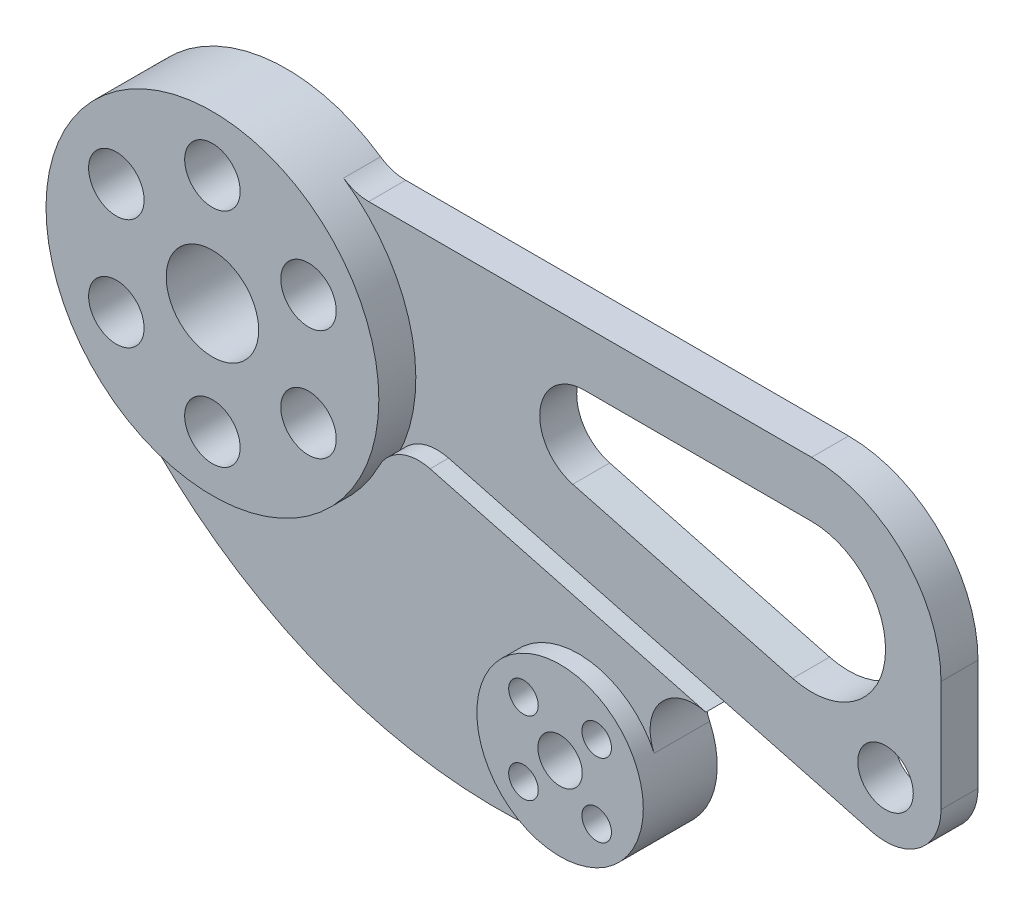
ISO-10303-21;
HEADER;
FILE_DESCRIPTION(('STEP AP214'),'2;1');
FILE_NAME('part.step','',(''),(''),'','','');
FILE_SCHEMA(('AUTOMOTIVE_DESIGN { 1 0 10303 214 1 1 1 1 }'));
ENDSEC;
DATA;
#1=APPLICATION_CONTEXT('core data for automotive mechanical design processes');
#2=APPLICATION_PROTOCOL_DEFINITION('international standard','automotive_design',2000,#1);
#3=PRODUCT_CONTEXT('',#1,'mechanical');
#4=PRODUCT('Part','Part','',(#3));
#5=PRODUCT_RELATED_PRODUCT_CATEGORY('part','',(#4));
#6=PRODUCT_DEFINITION_FORMATION('','',#4);
#7=PRODUCT_DEFINITION_CONTEXT('part definition',#1,'design');
#8=PRODUCT_DEFINITION('design','',#6,#7);
#9=PRODUCT_DEFINITION_SHAPE('','',#8);
#10=(LENGTH_UNIT() NAMED_UNIT(*) SI_UNIT(.MILLI.,.METRE.));
#11=(NAMED_UNIT(*) PLANE_ANGLE_UNIT() SI_UNIT($,.RADIAN.));
#12=(NAMED_UNIT(*) SI_UNIT($,.STERADIAN.) SOLID_ANGLE_UNIT());
#13=UNCERTAINTY_MEASURE_WITH_UNIT(LENGTH_MEASURE(1.E-05),#10,'distance_accuracy_value','');
#14=(GEOMETRIC_REPRESENTATION_CONTEXT(3) GLOBAL_UNCERTAINTY_ASSIGNED_CONTEXT((#13)) GLOBAL_UNIT_ASSIGNED_CONTEXT((#10,
#11,#12)) REPRESENTATION_CONTEXT('',''));
#15=CARTESIAN_POINT('',(0.,0.,0.));
#16=DIRECTION('',(0.,0.,1.));
#17=DIRECTION('',(1.,0.,0.));
#18=AXIS2_PLACEMENT_3D('',#15,#16,#17);
#19=CARTESIAN_POINT('',(0.,0.,20.));
#20=DIRECTION('',(0.,0.,-1.));
#21=DIRECTION('',(-1.,0.,0.));
#22=AXIS2_PLACEMENT_3D('',#19,#20,#21);
#23=CYLINDRICAL_SURFACE('',#22,45.);
#24=CARTESIAN_POINT('',(0.,0.,20.));
#25=DIRECTION('',(0.,0.,1.));
#26=DIRECTION('',(1.,0.,0.));
#27=AXIS2_PLACEMENT_3D('',#24,#25,#26);
#28=CIRCLE('',#27,45.);
#29=CARTESIAN_POINT('',(45.,0.,20.));
#30=VERTEX_POINT('',#29);
#31=EDGE_CURVE('E228',#30,#30,#28,.T.);
#32=ORIENTED_EDGE('',*,*,#31,.F.);
#33=EDGE_LOOP('',(#32));
#34=FACE_BOUND('',#33,.T.);
#35=DIRECTION('',(0.,0.,-1.));
#36=VECTOR('',#35,1.);
#37=CARTESIAN_POINT('',(-38.103740681001,-23.9396104002348,15.));
#38=LINE('',#37,#36);
#39=CARTESIAN_POINT('',(-38.103740681001,-23.9396104002348,15.));
#40=VERTEX_POINT('',#39);
#41=CARTESIAN_POINT('',(-38.103740681001,-23.9396104002348,0.));
#42=VERTEX_POINT('',#41);
#43=EDGE_CURVE('E167',#40,#42,#38,.T.);
#44=ORIENTED_EDGE('',*,*,#43,.F.);
#45=CARTESIAN_POINT('',(0.,0.,15.));
#46=DIRECTION('',(0.,0.,1.));
#47=DIRECTION('',(1.,0.,0.));
#48=AXIS2_PLACEMENT_3D('',#45,#46,#47);
#49=CIRCLE('',#48,45.);
#50=CARTESIAN_POINT('',(40.1039882650915,-20.4124992402549,15.));
#51=VERTEX_POINT('',#50);
#52=EDGE_CURVE('E176',#40,#51,#49,.T.);
#53=ORIENTED_EDGE('',*,*,#52,.T.);
#54=DIRECTION('',(0.,0.,-1.));
#55=VECTOR('',#54,1.);
#56=CARTESIAN_POINT('',(40.1039882650915,-20.4124992402549,15.));
#57=LINE('',#56,#55);
#58=CARTESIAN_POINT('',(40.1039882650915,-20.4124992402549,10.));
#59=VERTEX_POINT('',#58);
#60=EDGE_CURVE('E189',#51,#59,#57,.T.);
#61=ORIENTED_EDGE('',*,*,#60,.T.);
#62=CARTESIAN_POINT('',(0.,0.,10.));
#63=DIRECTION('',(0.,0.,1.));
#64=DIRECTION('',(1.,0.,0.));
#65=AXIS2_PLACEMENT_3D('',#62,#63,#64);
#66=CIRCLE('',#65,45.);
#67=CARTESIAN_POINT('',(25.4597613104165,37.1052631578947,10.));
#68=VERTEX_POINT('',#67);
#69=EDGE_CURVE('E271',#59,#68,#66,.T.);
#70=ORIENTED_EDGE('',*,*,#69,.T.);
#71=DIRECTION('',(0.,0.,-1.));
#72=VECTOR('',#71,1.);
#73=CARTESIAN_POINT('',(25.4597613104165,37.1052631578947,10.));
#74=LINE('',#73,#72);
#75=CARTESIAN_POINT('',(25.4597613104165,37.1052631578947,0.));
#76=VERTEX_POINT('',#75);
#77=EDGE_CURVE('E287',#68,#76,#74,.T.);
#78=ORIENTED_EDGE('',*,*,#77,.T.);
#79=CARTESIAN_POINT('',(0.,0.,0.));
#80=DIRECTION('',(0.,0.,1.));
#81=DIRECTION('',(1.,0.,0.));
#82=AXIS2_PLACEMENT_3D('',#79,#80,#81);
#83=CIRCLE('',#82,45.);
#84=EDGE_CURVE('E210',#76,#42,#83,.T.);
#85=ORIENTED_EDGE('',*,*,#84,.T.);
#86=EDGE_LOOP('',(#44,#53,#61,#70,#78,#85));
#87=FACE_BOUND('',#86,.T.);
#88=ADVANCED_FACE('F36',(#34,#87),#23,.T.);
#89=CARTESIAN_POINT('',(90.4975746549419,7.99999999999999,10.));
#90=DIRECTION('',(0.,0.,-1.));
#91=DIRECTION('',(-1.,0.,0.));
#92=AXIS2_PLACEMENT_3D('',#89,#90,#91);
#93=CYLINDRICAL_SURFACE('',#92,12.);
#94=CARTESIAN_POINT('',(90.4975746549419,7.99999999999999,0.));
#95=DIRECTION('',(0.,0.,1.));
#96=DIRECTION('',(1.,0.,0.));
#97=AXIS2_PLACEMENT_3D('',#94,#95,#96);
#98=CIRCLE('',#97,12.);
#99=CARTESIAN_POINT('',(90.4975746549419,20.,0.));
#100=VERTEX_POINT('',#99);
#101=CARTESIAN_POINT('',(87.4276884417238,-3.60068095578415,0.));
#102=VERTEX_POINT('',#101);
#103=EDGE_CURVE('E306',#100,#102,#98,.T.);
#104=ORIENTED_EDGE('',*,*,#103,.F.);
#105=DIRECTION('',(0.,0.,-1.));
#106=VECTOR('',#105,1.);
#107=CARTESIAN_POINT('',(90.4975746549419,20.,10.));
#108=LINE('',#107,#106);
#109=CARTESIAN_POINT('',(90.4975746549419,20.,10.));
#110=VERTEX_POINT('',#109);
#111=EDGE_CURVE('E11',#110,#100,#108,.T.);
#112=ORIENTED_EDGE('',*,*,#111,.F.);
#113=CARTESIAN_POINT('',(90.4975746549419,7.99999999999999,10.));
#114=DIRECTION('',(0.,0.,1.));
#115=DIRECTION('',(1.,0.,0.));
#116=AXIS2_PLACEMENT_3D('',#113,#114,#115);
#117=CIRCLE('',#116,12.);
#118=CARTESIAN_POINT('',(87.4276884417238,-3.60068095578415,10.));
#119=VERTEX_POINT('',#118);
#120=EDGE_CURVE('E276',#110,#119,#117,.T.);
#121=ORIENTED_EDGE('',*,*,#120,.T.);
#122=DIRECTION('',(0.,0.,-1.));
#123=VECTOR('',#122,1.);
#124=CARTESIAN_POINT('',(87.4276884417238,-3.60068095578415,10.));
#125=LINE('',#124,#123);
#126=EDGE_CURVE('E317',#119,#102,#125,.T.);
#127=ORIENTED_EDGE('',*,*,#126,.T.);
#128=EDGE_LOOP('',(#104,#112,#121,#127));
#129=FACE_BOUND('',#128,.T.);
#130=ADVANCED_FACE('F354',(#129),#93,.F.);
#131=CARTESIAN_POINT('',(0.,20.,10.));
#132=DIRECTION('',(0.,-1.,0.));
#133=DIRECTION('',(1.,0.,0.));
#134=AXIS2_PLACEMENT_3D('',#131,#132,#133);
#135=PLANE('',#134);
#136=DIRECTION('',(-1.,0.,0.));
#137=VECTOR('',#136,1.);
#138=CARTESIAN_POINT('',(0.,20.,0.));
#139=LINE('',#138,#137);
#140=CARTESIAN_POINT('',(152.,20.,0.));
#141=VERTEX_POINT('',#140);
#142=EDGE_CURVE('E309',#141,#100,#139,.T.);
#143=ORIENTED_EDGE('',*,*,#142,.F.);
#144=DIRECTION('',(0.,0.,-1.));
#145=VECTOR('',#144,1.);
#146=CARTESIAN_POINT('',(152.,20.,10.));
#147=LINE('',#146,#145);
#148=CARTESIAN_POINT('',(152.,20.,10.));
#149=VERTEX_POINT('',#148);
#150=EDGE_CURVE('E45',#149,#141,#147,.T.);
#151=ORIENTED_EDGE('',*,*,#150,.F.);
#152=DIRECTION('',(-1.,0.,0.));
#153=VECTOR('',#152,1.);
#154=CARTESIAN_POINT('',(0.,20.,10.));
#155=LINE('',#154,#153);
#156=EDGE_CURVE('E279',#149,#110,#155,.T.);
#157=ORIENTED_EDGE('',*,*,#156,.T.);
#158=ORIENTED_EDGE('',*,*,#111,.T.);
#159=EDGE_LOOP('',(#143,#151,#157,#158));
#160=FACE_BOUND('',#159,.T.);
#161=ADVANCED_FACE('F350',(#160),#135,.T.);
#162=CARTESIAN_POINT('',(152.,0.,10.));
#163=DIRECTION('',(0.,0.,-1.));
#164=DIRECTION('',(-1.,0.,0.));
#165=AXIS2_PLACEMENT_3D('',#162,#163,#164);
#166=CYLINDRICAL_SURFACE('',#165,20.);
#167=CARTESIAN_POINT('',(152.,0.,0.));
#168=DIRECTION('',(0.,0.,1.));
#169=DIRECTION('',(1.,0.,0.));
#170=AXIS2_PLACEMENT_3D('',#167,#168,#169);
#171=CIRCLE('',#170,20.);
#172=CARTESIAN_POINT('',(146.88352297797,-19.3344682596403,0.));
#173=VERTEX_POINT('',#172);
#174=EDGE_CURVE('E312',#173,#141,#171,.T.);
#175=ORIENTED_EDGE('',*,*,#174,.F.);
#176=DIRECTION('',(0.,0.,-1.));
#177=VECTOR('',#176,1.);
#178=CARTESIAN_POINT('',(146.88352297797,-19.3344682596403,10.));
#179=LINE('',#178,#177);
#180=CARTESIAN_POINT('',(146.88352297797,-19.3344682596403,10.));
#181=VERTEX_POINT('',#180);
#182=EDGE_CURVE('E319',#181,#173,#179,.T.);
#183=ORIENTED_EDGE('',*,*,#182,.F.);
#184=CARTESIAN_POINT('',(152.,0.,10.));
#185=DIRECTION('',(0.,0.,1.));
#186=DIRECTION('',(1.,0.,0.));
#187=AXIS2_PLACEMENT_3D('',#184,#185,#186);
#188=CIRCLE('',#187,20.);
#189=EDGE_CURVE('E282',#181,#149,#188,.T.);
#190=ORIENTED_EDGE('',*,*,#189,.T.);
#191=ORIENTED_EDGE('',*,*,#150,.T.);
#192=EDGE_LOOP('',(#175,#183,#190,#191));
#193=FACE_BOUND('',#192,.T.);
#194=ADVANCED_FACE('F344',(#193),#166,.F.);
#195=CARTESIAN_POINT('',(0.,0.,10.));
#196=DIRECTION('',(-0.255823851101514,-0.966723412982012,0.));
#197=DIRECTION('',(0.966723412982013,-0.255823851101514,0.));
#198=AXIS2_PLACEMENT_3D('',#195,#196,#197);
#199=PLANE('',#198);
#200=DIRECTION('',(0.,0.,-1.));
#201=VECTOR('',#200,1.);
#202=CARTESIAN_POINT('',(128.412955315551,-33.9818983578937,15.));
#203=LINE('',#202,#201);
#204=CARTESIAN_POINT('',(128.412955315551,-33.9818983578937,10.));
#205=VERTEX_POINT('',#204);
#206=CARTESIAN_POINT('',(128.412955315551,-33.9818983578937,0.));
#207=VERTEX_POINT('',#206);
#208=EDGE_CURVE('E60',#205,#207,#203,.T.);
#209=ORIENTED_EDGE('',*,*,#208,.T.);
#210=DIRECTION('',(-0.966723412982013,0.255823851101514,0.));
#211=VECTOR('',#210,1.);
#212=CARTESIAN_POINT('',(0.,0.,0.));
#213=LINE('',#212,#211);
#214=CARTESIAN_POINT('',(168.162642233477,-44.5008511947302,0.));
#215=VERTEX_POINT('',#214);
#216=EDGE_CURVE('E231',#215,#207,#213,.T.);
#217=ORIENTED_EDGE('',*,*,#216,.F.);
#218=DIRECTION('',(0.,0.,-1.));
#219=VECTOR('',#218,1.);
#220=CARTESIAN_POINT('',(168.162642233477,-44.5008511947302,10.));
#221=LINE('',#220,#219);
#222=CARTESIAN_POINT('',(168.162642233477,-44.5008511947302,10.));
#223=VERTEX_POINT('',#222);
#224=EDGE_CURVE('E40',#223,#215,#221,.T.);
#225=ORIENTED_EDGE('',*,*,#224,.F.);
#226=DIRECTION('',(-0.966723412982013,0.255823851101514,0.));
#227=VECTOR('',#226,1.);
#228=CARTESIAN_POINT('',(0.,0.,10.));
#229=LINE('',#228,#227);
#230=EDGE_CURVE('E256',#223,#205,#229,.T.);
#231=ORIENTED_EDGE('',*,*,#230,.T.);
#232=EDGE_LOOP('',(#209,#217,#225,#231));
#233=FACE_BOUND('',#232,.T.);
#234=ADVANCED_FACE('F38',(#233),#199,.T.);
#235=CARTESIAN_POINT('',(172.,-30.,10.));
#236=DIRECTION('',(0.,0.,-1.));
#237=DIRECTION('',(-1.,0.,0.));
#238=AXIS2_PLACEMENT_3D('',#235,#236,#237);
#239=CYLINDRICAL_SURFACE('',#238,15.);
#240=CARTESIAN_POINT('',(172.,-30.,0.));
#241=DIRECTION('',(0.,0.,1.));
#242=DIRECTION('',(1.,0.,0.));
#243=AXIS2_PLACEMENT_3D('',#240,#241,#242);
#244=CIRCLE('',#243,15.);
#245=CARTESIAN_POINT('',(187.,-30.,0.));
#246=VERTEX_POINT('',#245);
#247=EDGE_CURVE('E289',#215,#246,#244,.T.);
#248=ORIENTED_EDGE('',*,*,#247,.T.);
#249=DIRECTION('',(0.,0.,-1.));
#250=VECTOR('',#249,1.);
#251=CARTESIAN_POINT('',(187.,-30.,10.));
#252=LINE('',#251,#250);
#253=CARTESIAN_POINT('',(187.,-30.,10.));
#254=VERTEX_POINT('',#253);
#255=EDGE_CURVE('E330',#254,#246,#252,.T.);
#256=ORIENTED_EDGE('',*,*,#255,.F.);
#257=CARTESIAN_POINT('',(172.,-30.,10.));
#258=DIRECTION('',(0.,0.,1.));
#259=DIRECTION('',(1.,0.,0.));
#260=AXIS2_PLACEMENT_3D('',#257,#258,#259);
#261=CIRCLE('',#260,15.);
#262=EDGE_CURVE('E259',#223,#254,#261,.T.);
#263=ORIENTED_EDGE('',*,*,#262,.F.);
#264=ORIENTED_EDGE('',*,*,#224,.T.);
#265=EDGE_LOOP('',(#248,#256,#263,#264));
#266=FACE_BOUND('',#265,.T.);
#267=ADVANCED_FACE('F337',(#266),#239,.T.);
#268=CARTESIAN_POINT('',(187.,0.,10.));
#269=DIRECTION('',(1.,0.,0.));
#270=DIRECTION('',(0.,0.,-1.));
#271=AXIS2_PLACEMENT_3D('',#268,#269,#270);
#272=PLANE('',#271);
#273=DIRECTION('',(0.,-1.,0.));
#274=VECTOR('',#273,1.);
#275=CARTESIAN_POINT('',(187.,0.,0.));
#276=LINE('',#275,#274);
#277=CARTESIAN_POINT('',(187.,0.,0.));
#278=VERTEX_POINT('',#277);
#279=EDGE_CURVE('E292',#278,#246,#276,.T.);
#280=ORIENTED_EDGE('',*,*,#279,.F.);
#281=DIRECTION('',(0.,0.,-1.));
#282=VECTOR('',#281,1.);
#283=CARTESIAN_POINT('',(187.,0.,10.));
#284=LINE('',#283,#282);
#285=CARTESIAN_POINT('',(187.,0.,10.));
#286=VERTEX_POINT('',#285);
#287=EDGE_CURVE('E329',#286,#278,#284,.T.);
#288=ORIENTED_EDGE('',*,*,#287,.F.);
#289=DIRECTION('',(0.,-1.,0.));
#290=VECTOR('',#289,1.);
#291=CARTESIAN_POINT('',(187.,0.,10.));
#292=LINE('',#291,#290);
#293=EDGE_CURVE('E261',#286,#254,#292,.T.);
#294=ORIENTED_EDGE('',*,*,#293,.T.);
#295=ORIENTED_EDGE('',*,*,#255,.T.);
#296=EDGE_LOOP('',(#280,#288,#294,#295));
#297=FACE_BOUND('',#296,.T.);
#298=ADVANCED_FACE('F349',(#297),#272,.T.);
#299=CARTESIAN_POINT('',(152.,0.,10.));
#300=DIRECTION('',(0.,0.,-1.));
#301=DIRECTION('',(-1.,0.,0.));
#302=AXIS2_PLACEMENT_3D('',#299,#300,#301);
#303=CYLINDRICAL_SURFACE('',#302,35.);
#304=CARTESIAN_POINT('',(152.,0.,0.));
#305=DIRECTION('',(0.,0.,1.));
#306=DIRECTION('',(1.,0.,0.));
#307=AXIS2_PLACEMENT_3D('',#304,#305,#306);
#308=CIRCLE('',#307,35.);
#309=CARTESIAN_POINT('',(152.,35.,0.));
#310=VERTEX_POINT('',#309);
#311=EDGE_CURVE('E295',#278,#310,#308,.T.);
#312=ORIENTED_EDGE('',*,*,#311,.T.);
#313=DIRECTION('',(0.,0.,-1.));
#314=VECTOR('',#313,1.);
#315=CARTESIAN_POINT('',(152.,35.,10.));
#316=LINE('',#315,#314);
#317=CARTESIAN_POINT('',(152.,35.,10.));
#318=VERTEX_POINT('',#317);
#319=EDGE_CURVE('E326',#318,#310,#316,.T.);
#320=ORIENTED_EDGE('',*,*,#319,.F.);
#321=CARTESIAN_POINT('',(152.,0.,10.));
#322=DIRECTION('',(0.,0.,1.));
#323=DIRECTION('',(1.,0.,0.));
#324=AXIS2_PLACEMENT_3D('',#321,#322,#323);
#325=CIRCLE('',#324,35.);
#326=EDGE_CURVE('E264',#286,#318,#325,.T.);
#327=ORIENTED_EDGE('',*,*,#326,.F.);
#328=ORIENTED_EDGE('',*,*,#287,.T.);
#329=EDGE_LOOP('',(#312,#320,#327,#328));
#330=FACE_BOUND('',#329,.T.);
#331=ADVANCED_FACE('F419',(#330),#303,.T.);
#332=CARTESIAN_POINT('',(0.,35.,10.));
#333=DIRECTION('',(0.,-1.,0.));
#334=DIRECTION('',(1.,0.,0.));
#335=AXIS2_PLACEMENT_3D('',#332,#333,#334);
#336=PLANE('',#335);
#337=DIRECTION('',(-1.,0.,0.));
#338=VECTOR('',#337,1.);
#339=CARTESIAN_POINT('',(0.,35.,0.));
#340=LINE('',#339,#338);
#341=CARTESIAN_POINT('',(32.2490309931942,35.,0.));
#342=VERTEX_POINT('',#341);
#343=EDGE_CURVE('E297',#310,#342,#340,.T.);
#344=ORIENTED_EDGE('',*,*,#343,.T.);
#345=DIRECTION('',(0.,0.,-1.));
#346=VECTOR('',#345,1.);
#347=CARTESIAN_POINT('',(32.2490309931942,35.,10.));
#348=LINE('',#347,#346);
#349=CARTESIAN_POINT('',(32.2490309931942,35.,10.));
#350=VERTEX_POINT('',#349);
#351=EDGE_CURVE('E324',#350,#342,#348,.T.);
#352=ORIENTED_EDGE('',*,*,#351,.F.);
#353=DIRECTION('',(-1.,0.,0.));
#354=VECTOR('',#353,1.);
#355=CARTESIAN_POINT('',(0.,35.,10.));
#356=LINE('',#355,#354);
#357=EDGE_CURVE('E266',#318,#350,#356,.T.);
#358=ORIENTED_EDGE('',*,*,#357,.F.);
#359=ORIENTED_EDGE('',*,*,#319,.T.);
#360=EDGE_LOOP('',(#344,#352,#358,#359));
#361=FACE_BOUND('',#360,.T.);
#362=ADVANCED_FACE('F415',(#361),#336,.F.);
#363=CARTESIAN_POINT('',(32.2490309931942,47.,10.));
#364=DIRECTION('',(0.,0.,-1.));
#365=DIRECTION('',(-1.,0.,0.));
#366=AXIS2_PLACEMENT_3D('',#363,#364,#365);
#367=CYLINDRICAL_SURFACE('',#366,12.);
#368=CARTESIAN_POINT('',(32.2490309931942,47.,0.));
#369=DIRECTION('',(0.,0.,1.));
#370=DIRECTION('',(1.,0.,0.));
#371=AXIS2_PLACEMENT_3D('',#368,#369,#370);
#372=CIRCLE('',#371,12.);
#373=EDGE_CURVE('E300',#76,#342,#372,.T.);
#374=ORIENTED_EDGE('',*,*,#373,.F.);
#375=ORIENTED_EDGE('',*,*,#77,.F.);
#376=CARTESIAN_POINT('',(32.2490309931942,47.,10.));
#377=DIRECTION('',(0.,0.,1.));
#378=DIRECTION('',(1.,0.,0.));
#379=AXIS2_PLACEMENT_3D('',#376,#377,#378);
#380=CIRCLE('',#379,12.);
#381=EDGE_CURVE('E268',#68,#350,#380,.T.);
#382=ORIENTED_EDGE('',*,*,#381,.T.);
#383=ORIENTED_EDGE('',*,*,#351,.T.);
#384=EDGE_LOOP('',(#374,#375,#382,#383));
#385=FACE_BOUND('',#384,.T.);
#386=ADVANCED_FACE('F411',(#385),#367,.F.);
#387=CARTESIAN_POINT('',(172.,-30.,10.));
#388=DIRECTION('',(0.,0.,-1.));
#389=DIRECTION('',(-1.,0.,0.));
#390=AXIS2_PLACEMENT_3D('',#387,#388,#389);
#391=CYLINDRICAL_SURFACE('',#390,7.50000000000001);
#392=CARTESIAN_POINT('',(172.,-30.,10.));
#393=DIRECTION('',(0.,0.,1.));
#394=DIRECTION('',(1.,0.,0.));
#395=AXIS2_PLACEMENT_3D('',#392,#393,#394);
#396=CIRCLE('',#395,7.50000000000001);
#397=CARTESIAN_POINT('',(179.5,-30.,10.));
#398=VERTEX_POINT('',#397);
#399=EDGE_CURVE('E273',#398,#398,#396,.T.);
#400=ORIENTED_EDGE('',*,*,#399,.T.);
#401=EDGE_LOOP('',(#400));
#402=FACE_BOUND('',#401,.T.);
#403=CARTESIAN_POINT('',(172.,-30.,0.));
#404=DIRECTION('',(0.,0.,1.));
#405=DIRECTION('',(1.,0.,0.));
#406=AXIS2_PLACEMENT_3D('',#403,#404,#405);
#407=CIRCLE('',#406,7.50000000000001);
#408=CARTESIAN_POINT('',(179.5,-30.,0.));
#409=VERTEX_POINT('',#408);
#410=EDGE_CURVE('E303',#409,#409,#407,.T.);
#411=ORIENTED_EDGE('',*,*,#410,.F.);
#412=EDGE_LOOP('',(#411));
#413=FACE_BOUND('',#412,.T.);
#414=ADVANCED_FACE('F403',(#402,#413),#391,.F.);
#415=CARTESIAN_POINT('',(4.83129108241596,18.2567895221365,10.));
#416=DIRECTION('',(-0.255823851101514,-0.966723412982012,0.));
#417=DIRECTION('',(0.966723412982013,-0.255823851101514,0.));
#418=AXIS2_PLACEMENT_3D('',#415,#416,#417);
#419=PLANE('',#418);
#420=DIRECTION('',(-0.966723412982013,0.255823851101514,0.));
#421=VECTOR('',#420,1.);
#422=CARTESIAN_POINT('',(4.83129108241596,18.2567895221365,0.));
#423=LINE('',#422,#421);
#424=EDGE_CURVE('E257',#173,#102,#423,.T.);
#425=ORIENTED_EDGE('',*,*,#424,.T.);
#426=ORIENTED_EDGE('',*,*,#126,.F.);
#427=DIRECTION('',(-0.966723412982013,0.255823851101514,0.));
#428=VECTOR('',#427,1.);
#429=CARTESIAN_POINT('',(4.83129108241596,18.2567895221365,10.));
#430=LINE('',#429,#428);
#431=EDGE_CURVE('E285',#181,#119,#430,.T.);
#432=ORIENTED_EDGE('',*,*,#431,.F.);
#433=ORIENTED_EDGE('',*,*,#182,.T.);
#434=EDGE_LOOP('',(#425,#426,#432,#433));
#435=FACE_BOUND('',#434,.T.);
#436=ADVANCED_FACE('F399',(#435),#419,.F.);
#437=CARTESIAN_POINT('',(0.,0.,10.));
#438=DIRECTION('',(0.,0.,1.));
#439=DIRECTION('',(1.,0.,0.));
#440=AXIS2_PLACEMENT_3D('',#437,#438,#439);
#441=PLANE('',#440);
#442=CARTESIAN_POINT('',(50.7983851357825,-25.8558323709895,10.));
#443=DIRECTION('',(0.,0.,1.));
#444=DIRECTION('',(1.,0.,0.));
#445=AXIS2_PLACEMENT_3D('',#442,#443,#444);
#446=CIRCLE('',#445,12.);
#447=CARTESIAN_POINT('',(53.8682713490007,-14.2551514152054,10.));
#448=VERTEX_POINT('',#447);
#449=EDGE_CURVE('E253',#448,#59,#446,.T.);
#450=ORIENTED_EDGE('',*,*,#449,.F.);
#451=DIRECTION('',(0.966723412982012,-0.255823851101514,0.));
#452=VECTOR('',#451,1.);
#453=CARTESIAN_POINT('',(0.,0.,10.));
#454=LINE('',#453,#452);
#455=EDGE_CURVE('E53',#448,#205,#454,.T.);
#456=ORIENTED_EDGE('',*,*,#455,.T.);
#457=ORIENTED_EDGE('',*,*,#230,.F.);
#458=ORIENTED_EDGE('',*,*,#262,.T.);
#459=ORIENTED_EDGE('',*,*,#293,.F.);
#460=ORIENTED_EDGE('',*,*,#326,.T.);
#461=ORIENTED_EDGE('',*,*,#357,.T.);
#462=ORIENTED_EDGE('',*,*,#381,.F.);
#463=ORIENTED_EDGE('',*,*,#69,.F.);
#464=EDGE_LOOP('',(#450,#456,#457,#458,#459,#460,#461,#462,#463));
#465=FACE_BOUND('',#464,.T.);
#466=ORIENTED_EDGE('',*,*,#399,.F.);
#467=EDGE_LOOP('',(#466));
#468=FACE_BOUND('',#467,.T.);
#469=ORIENTED_EDGE('',*,*,#120,.F.);
#470=ORIENTED_EDGE('',*,*,#156,.F.);
#471=ORIENTED_EDGE('',*,*,#189,.F.);
#472=ORIENTED_EDGE('',*,*,#431,.T.);
#473=EDGE_LOOP('',(#469,#470,#471,#472));
#474=FACE_BOUND('',#473,.T.);
#475=ADVANCED_FACE('F396',(#465,#468,#474),#441,.T.);
#476=CARTESIAN_POINT('',(0.,0.,0.));
#477=DIRECTION('',(0.,0.,1.));
#478=DIRECTION('',(1.,0.,0.));
#479=AXIS2_PLACEMENT_3D('',#476,#477,#478);
#480=PLANE('',#479);
#481=ORIENTED_EDGE('',*,*,#216,.T.);
#482=CARTESIAN_POINT('',(125.343069102333,-45.5825793136779,0.));
#483=DIRECTION('',(0.,0.,1.));
#484=DIRECTION('',(1.,0.,0.));
#485=AXIS2_PLACEMENT_3D('',#482,#483,#484);
#486=CIRCLE('',#485,12.);
#487=CARTESIAN_POINT('',(114.441132023261,-50.5973343350073,0.));
#488=VERTEX_POINT('',#487);
#489=EDGE_CURVE('E191',#207,#488,#486,.T.);
#490=ORIENTED_EDGE('',*,*,#489,.T.);
#491=CARTESIAN_POINT('',(94.,-60.,0.));
#492=DIRECTION('',(0.,0.,1.));
#493=DIRECTION('',(1.,0.,0.));
#494=AXIS2_PLACEMENT_3D('',#491,#492,#493);
#495=CIRCLE('',#494,22.5);
#496=CARTESIAN_POINT('',(98.6101490330927,-82.0226366698603,0.));
#497=VERTEX_POINT('',#496);
#498=EDGE_CURVE('E439',#497,#488,#495,.T.);
#499=ORIENTED_EDGE('',*,*,#498,.F.);
#500=CARTESIAN_POINT('',(71.9737323974463,45.2192640893325,0.));
#501=DIRECTION('',(0.,0.,1.));
#502=DIRECTION('',(1.,0.,0.));
#503=AXIS2_PLACEMENT_3D('',#500,#501,#502);
#504=CIRCLE('',#503,130.);
#505=EDGE_CURVE('E162',#42,#497,#504,.T.);
#506=ORIENTED_EDGE('',*,*,#505,.F.);
#507=ORIENTED_EDGE('',*,*,#84,.F.);
#508=ORIENTED_EDGE('',*,*,#373,.T.);
#509=ORIENTED_EDGE('',*,*,#343,.F.);
#510=ORIENTED_EDGE('',*,*,#311,.F.);
#511=ORIENTED_EDGE('',*,*,#279,.T.);
#512=ORIENTED_EDGE('',*,*,#247,.F.);
#513=EDGE_LOOP('',(#481,#490,#499,#506,#507,#508,#509,#510,#511,#512));
#514=FACE_BOUND('',#513,.T.);
#515=ORIENTED_EDGE('',*,*,#410,.T.);
#516=EDGE_LOOP('',(#515));
#517=FACE_BOUND('',#516,.T.);
#518=ORIENTED_EDGE('',*,*,#103,.T.);
#519=ORIENTED_EDGE('',*,*,#424,.F.);
#520=ORIENTED_EDGE('',*,*,#174,.T.);
#521=ORIENTED_EDGE('',*,*,#142,.T.);
#522=EDGE_LOOP('',(#518,#519,#520,#521));
#523=FACE_BOUND('',#522,.T.);
#524=CARTESIAN_POINT('',(0.,0.,0.));
#525=DIRECTION('',(0.,0.,1.));
#526=DIRECTION('',(1.,0.,0.));
#527=AXIS2_PLACEMENT_3D('',#524,#525,#526);
#528=CIRCLE('',#527,12.5);
#529=CARTESIAN_POINT('',(12.5,0.,0.));
#530=VERTEX_POINT('',#529);
#531=EDGE_CURVE('E205',#530,#530,#528,.T.);
#532=ORIENTED_EDGE('',*,*,#531,.T.);
#533=EDGE_LOOP('',(#532));
#534=FACE_BOUND('',#533,.T.);
#535=CARTESIAN_POINT('',(-25.9807621135332,15.,0.));
#536=DIRECTION('',(0.,0.,1.));
#537=DIRECTION('',(1.,0.,0.));
#538=AXIS2_PLACEMENT_3D('',#535,#536,#537);
#539=CIRCLE('',#538,7.5);
#540=CARTESIAN_POINT('',(-18.4807621135332,15.,0.));
#541=VERTEX_POINT('',#540);
#542=EDGE_CURVE('E234',#541,#541,#539,.T.);
#543=ORIENTED_EDGE('',*,*,#542,.T.);
#544=EDGE_LOOP('',(#543));
#545=FACE_BOUND('',#544,.T.);
#546=CARTESIAN_POINT('',(-25.9807621135332,-15.,0.));
#547=DIRECTION('',(0.,0.,1.));
#548=DIRECTION('',(1.,0.,0.));
#549=AXIS2_PLACEMENT_3D('',#546,#547,#548);
#550=CIRCLE('',#549,7.5);
#551=CARTESIAN_POINT('',(-18.4807621135332,-15.,0.));
#552=VERTEX_POINT('',#551);
#553=EDGE_CURVE('E237',#552,#552,#550,.T.);
#554=ORIENTED_EDGE('',*,*,#553,.T.);
#555=EDGE_LOOP('',(#554));
#556=FACE_BOUND('',#555,.T.);
#557=CARTESIAN_POINT('',(0.,-30.,0.));
#558=DIRECTION('',(0.,0.,1.));
#559=DIRECTION('',(1.,0.,0.));
#560=AXIS2_PLACEMENT_3D('',#557,#558,#559);
#561=CIRCLE('',#560,7.5);
#562=CARTESIAN_POINT('',(7.5,-30.,0.));
#563=VERTEX_POINT('',#562);
#564=EDGE_CURVE('E240',#563,#563,#561,.T.);
#565=ORIENTED_EDGE('',*,*,#564,.T.);
#566=EDGE_LOOP('',(#565));
#567=FACE_BOUND('',#566,.T.);
#568=CARTESIAN_POINT('',(25.9807621135332,-15.,0.));
#569=DIRECTION('',(0.,0.,1.));
#570=DIRECTION('',(1.,0.,0.));
#571=AXIS2_PLACEMENT_3D('',#568,#569,#570);
#572=CIRCLE('',#571,7.5);
#573=CARTESIAN_POINT('',(33.4807621135332,-15.,0.));
#574=VERTEX_POINT('',#573);
#575=EDGE_CURVE('E243',#574,#574,#572,.T.);
#576=ORIENTED_EDGE('',*,*,#575,.T.);
#577=EDGE_LOOP('',(#576));
#578=FACE_BOUND('',#577,.T.);
#579=CARTESIAN_POINT('',(25.9807621135332,15.,0.));
#580=DIRECTION('',(0.,0.,1.));
#581=DIRECTION('',(1.,0.,0.));
#582=AXIS2_PLACEMENT_3D('',#579,#580,#581);
#583=CIRCLE('',#582,7.5);
#584=CARTESIAN_POINT('',(33.4807621135332,15.,0.));
#585=VERTEX_POINT('',#584);
#586=EDGE_CURVE('E246',#585,#585,#583,.T.);
#587=ORIENTED_EDGE('',*,*,#586,.T.);
#588=EDGE_LOOP('',(#587));
#589=FACE_BOUND('',#588,.T.);
#590=CARTESIAN_POINT('',(0.,30.,0.));
#591=DIRECTION('',(0.,0.,1.));
#592=DIRECTION('',(1.,0.,0.));
#593=AXIS2_PLACEMENT_3D('',#590,#591,#592);
#594=CIRCLE('',#593,7.5);
#595=CARTESIAN_POINT('',(7.5,30.,0.));
#596=VERTEX_POINT('',#595);
#597=EDGE_CURVE('E249',#596,#596,#594,.T.);
#598=ORIENTED_EDGE('',*,*,#597,.T.);
#599=EDGE_LOOP('',(#598));
#600=FACE_BOUND('',#599,.T.);
#601=CARTESIAN_POINT('',(103.899494936612,-69.8994949366116,0.));
#602=DIRECTION('',(0.,0.,1.));
#603=DIRECTION('',(1.,0.,0.));
#604=AXIS2_PLACEMENT_3D('',#601,#602,#603);
#605=CIRCLE('',#604,4.00000000000001);
#606=CARTESIAN_POINT('',(107.899494936612,-69.8994949366116,0.));
#607=VERTEX_POINT('',#606);
#608=EDGE_CURVE('E498',#607,#607,#605,.T.);
#609=ORIENTED_EDGE('',*,*,#608,.T.);
#610=EDGE_LOOP('',(#609));
#611=FACE_BOUND('',#610,.T.);
#612=CARTESIAN_POINT('',(103.899494936612,-50.1005050633883,0.));
#613=DIRECTION('',(0.,0.,1.));
#614=DIRECTION('',(1.,0.,0.));
#615=AXIS2_PLACEMENT_3D('',#612,#613,#614);
#616=CIRCLE('',#615,4.00000000000001);
#617=CARTESIAN_POINT('',(107.899494936612,-50.1005050633883,0.));
#618=VERTEX_POINT('',#617);
#619=EDGE_CURVE('E502',#618,#618,#616,.T.);
#620=ORIENTED_EDGE('',*,*,#619,.T.);
#621=EDGE_LOOP('',(#620));
#622=FACE_BOUND('',#621,.T.);
#623=CARTESIAN_POINT('',(84.1005050633883,-50.1005050633884,0.));
#624=DIRECTION('',(0.,0.,1.));
#625=DIRECTION('',(1.,0.,0.));
#626=AXIS2_PLACEMENT_3D('',#623,#624,#625);
#627=CIRCLE('',#626,4.00000000000002);
#628=CARTESIAN_POINT('',(88.1005050633883,-50.1005050633884,0.));
#629=VERTEX_POINT('',#628);
#630=EDGE_CURVE('E506',#629,#629,#627,.T.);
#631=ORIENTED_EDGE('',*,*,#630,.T.);
#632=EDGE_LOOP('',(#631));
#633=FACE_BOUND('',#632,.T.);
#634=CARTESIAN_POINT('',(84.1005050633884,-69.8994949366117,0.));
#635=DIRECTION('',(0.,0.,1.));
#636=DIRECTION('',(1.,0.,0.));
#637=AXIS2_PLACEMENT_3D('',#634,#635,#636);
#638=CIRCLE('',#637,4.00000000000001);
#639=CARTESIAN_POINT('',(88.1005050633884,-69.8994949366117,0.));
#640=VERTEX_POINT('',#639);
#641=EDGE_CURVE('E447',#640,#640,#638,.T.);
#642=ORIENTED_EDGE('',*,*,#641,.T.);
#643=EDGE_LOOP('',(#642));
#644=FACE_BOUND('',#643,.T.);
#645=CARTESIAN_POINT('',(94.,-60.,0.));
#646=DIRECTION('',(0.,0.,1.));
#647=DIRECTION('',(1.,0.,0.));
#648=AXIS2_PLACEMENT_3D('',#645,#646,#647);
#649=CIRCLE('',#648,6.);
#650=CARTESIAN_POINT('',(100.,-60.,0.));
#651=VERTEX_POINT('',#650);
#652=EDGE_CURVE('E441',#651,#651,#649,.T.);
#653=ORIENTED_EDGE('',*,*,#652,.T.);
#654=EDGE_LOOP('',(#653));
#655=FACE_BOUND('',#654,.T.);
#656=ADVANCED_FACE('F339',(#514,#517,#523,#534,#545,#556,#567,#578,#589,#600,#611,#622,#633,
#644,#655),#480,.F.);
#657=CARTESIAN_POINT('',(0.,30.,20.));
#658=DIRECTION('',(0.,0.,-1.));
#659=DIRECTION('',(-1.,0.,0.));
#660=AXIS2_PLACEMENT_3D('',#657,#658,#659);
#661=CYLINDRICAL_SURFACE('',#660,7.5);
#662=CARTESIAN_POINT('',(0.,30.,20.));
#663=DIRECTION('',(0.,0.,1.));
#664=DIRECTION('',(1.,0.,0.));
#665=AXIS2_PLACEMENT_3D('',#662,#663,#664);
#666=CIRCLE('',#665,7.5);
#667=CARTESIAN_POINT('',(7.5,30.,20.));
#668=VERTEX_POINT('',#667);
#669=EDGE_CURVE('E225',#668,#668,#666,.T.);
#670=ORIENTED_EDGE('',*,*,#669,.T.);
#671=EDGE_LOOP('',(#670));
#672=FACE_BOUND('',#671,.T.);
#673=ORIENTED_EDGE('',*,*,#597,.F.);
#674=EDGE_LOOP('',(#673));
#675=FACE_BOUND('',#674,.T.);
#676=ADVANCED_FACE('F368',(#672,#675),#661,.F.);
#677=CARTESIAN_POINT('',(25.9807621135332,15.,20.));
#678=DIRECTION('',(0.,0.,-1.));
#679=DIRECTION('',(-1.,0.,0.));
#680=AXIS2_PLACEMENT_3D('',#677,#678,#679);
#681=CYLINDRICAL_SURFACE('',#680,7.5);
#682=CARTESIAN_POINT('',(25.9807621135332,15.,20.));
#683=DIRECTION('',(0.,0.,1.));
#684=DIRECTION('',(1.,0.,0.));
#685=AXIS2_PLACEMENT_3D('',#682,#683,#684);
#686=CIRCLE('',#685,7.5);
#687=CARTESIAN_POINT('',(33.4807621135332,15.,20.));
#688=VERTEX_POINT('',#687);
#689=EDGE_CURVE('E222',#688,#688,#686,.T.);
#690=ORIENTED_EDGE('',*,*,#689,.T.);
#691=EDGE_LOOP('',(#690));
#692=FACE_BOUND('',#691,.T.);
#693=ORIENTED_EDGE('',*,*,#586,.F.);
#694=EDGE_LOOP('',(#693));
#695=FACE_BOUND('',#694,.T.);
#696=ADVANCED_FACE('F371',(#692,#695),#681,.F.);
#697=CARTESIAN_POINT('',(25.9807621135332,-15.,20.));
#698=DIRECTION('',(0.,0.,-1.));
#699=DIRECTION('',(-1.,0.,0.));
#700=AXIS2_PLACEMENT_3D('',#697,#698,#699);
#701=CYLINDRICAL_SURFACE('',#700,7.5);
#702=CARTESIAN_POINT('',(25.9807621135332,-15.,20.));
#703=DIRECTION('',(0.,0.,1.));
#704=DIRECTION('',(1.,0.,0.));
#705=AXIS2_PLACEMENT_3D('',#702,#703,#704);
#706=CIRCLE('',#705,7.5);
#707=CARTESIAN_POINT('',(33.4807621135332,-15.,20.));
#708=VERTEX_POINT('',#707);
#709=EDGE_CURVE('E219',#708,#708,#706,.T.);
#710=ORIENTED_EDGE('',*,*,#709,.T.);
#711=EDGE_LOOP('',(#710));
#712=FACE_BOUND('',#711,.T.);
#713=ORIENTED_EDGE('',*,*,#575,.F.);
#714=EDGE_LOOP('',(#713));
#715=FACE_BOUND('',#714,.T.);
#716=ADVANCED_FACE('F375',(#712,#715),#701,.F.);
#717=CARTESIAN_POINT('',(0.,-30.,20.));
#718=DIRECTION('',(0.,0.,-1.));
#719=DIRECTION('',(-1.,0.,0.));
#720=AXIS2_PLACEMENT_3D('',#717,#718,#719);
#721=CYLINDRICAL_SURFACE('',#720,7.5);
#722=CARTESIAN_POINT('',(0.,-30.,20.));
#723=DIRECTION('',(0.,0.,1.));
#724=DIRECTION('',(1.,0.,0.));
#725=AXIS2_PLACEMENT_3D('',#722,#723,#724);
#726=CIRCLE('',#725,7.5);
#727=CARTESIAN_POINT('',(7.5,-30.,20.));
#728=VERTEX_POINT('',#727);
#729=EDGE_CURVE('E216',#728,#728,#726,.T.);
#730=ORIENTED_EDGE('',*,*,#729,.T.);
#731=EDGE_LOOP('',(#730));
#732=FACE_BOUND('',#731,.T.);
#733=ORIENTED_EDGE('',*,*,#564,.F.);
#734=EDGE_LOOP('',(#733));
#735=FACE_BOUND('',#734,.T.);
#736=ADVANCED_FACE('F379',(#732,#735),#721,.F.);
#737=CARTESIAN_POINT('',(-25.9807621135332,-15.,20.));
#738=DIRECTION('',(0.,0.,-1.));
#739=DIRECTION('',(-1.,0.,0.));
#740=AXIS2_PLACEMENT_3D('',#737,#738,#739);
#741=CYLINDRICAL_SURFACE('',#740,7.5);
#742=CARTESIAN_POINT('',(-25.9807621135332,-15.,20.));
#743=DIRECTION('',(0.,0.,1.));
#744=DIRECTION('',(1.,0.,0.));
#745=AXIS2_PLACEMENT_3D('',#742,#743,#744);
#746=CIRCLE('',#745,7.5);
#747=CARTESIAN_POINT('',(-18.4807621135332,-15.,20.));
#748=VERTEX_POINT('',#747);
#749=EDGE_CURVE('E213',#748,#748,#746,.T.);
#750=ORIENTED_EDGE('',*,*,#749,.T.);
#751=EDGE_LOOP('',(#750));
#752=FACE_BOUND('',#751,.T.);
#753=ORIENTED_EDGE('',*,*,#553,.F.);
#754=EDGE_LOOP('',(#753));
#755=FACE_BOUND('',#754,.T.);
#756=ADVANCED_FACE('F383',(#752,#755),#741,.F.);
#757=CARTESIAN_POINT('',(-25.9807621135332,15.,20.));
#758=DIRECTION('',(0.,0.,-1.));
#759=DIRECTION('',(-1.,0.,0.));
#760=AXIS2_PLACEMENT_3D('',#757,#758,#759);
#761=CYLINDRICAL_SURFACE('',#760,7.5);
#762=CARTESIAN_POINT('',(-25.9807621135332,15.,20.));
#763=DIRECTION('',(0.,0.,1.));
#764=DIRECTION('',(1.,0.,0.));
#765=AXIS2_PLACEMENT_3D('',#762,#763,#764);
#766=CIRCLE('',#765,7.5);
#767=CARTESIAN_POINT('',(-18.4807621135332,15.,20.));
#768=VERTEX_POINT('',#767);
#769=EDGE_CURVE('E209',#768,#768,#766,.T.);
#770=ORIENTED_EDGE('',*,*,#769,.T.);
#771=EDGE_LOOP('',(#770));
#772=FACE_BOUND('',#771,.T.);
#773=ORIENTED_EDGE('',*,*,#542,.F.);
#774=EDGE_LOOP('',(#773));
#775=FACE_BOUND('',#774,.T.);
#776=ADVANCED_FACE('F387',(#772,#775),#761,.F.);
#777=CARTESIAN_POINT('',(0.,0.,20.));
#778=DIRECTION('',(0.,0.,-1.));
#779=DIRECTION('',(-1.,0.,0.));
#780=AXIS2_PLACEMENT_3D('',#777,#778,#779);
#781=CYLINDRICAL_SURFACE('',#780,12.5);
#782=CARTESIAN_POINT('',(0.,0.,20.));
#783=DIRECTION('',(0.,0.,1.));
#784=DIRECTION('',(1.,0.,0.));
#785=AXIS2_PLACEMENT_3D('',#782,#783,#784);
#786=CIRCLE('',#785,12.5);
#787=CARTESIAN_POINT('',(12.5,0.,20.));
#788=VERTEX_POINT('',#787);
#789=EDGE_CURVE('E206',#788,#788,#786,.T.);
#790=ORIENTED_EDGE('',*,*,#789,.T.);
#791=EDGE_LOOP('',(#790));
#792=FACE_BOUND('',#791,.T.);
#793=ORIENTED_EDGE('',*,*,#531,.F.);
#794=EDGE_LOOP('',(#793));
#795=FACE_BOUND('',#794,.T.);
#796=ADVANCED_FACE('F391',(#792,#795),#781,.F.);
#797=CARTESIAN_POINT('',(0.,0.,20.));
#798=DIRECTION('',(0.,0.,1.));
#799=DIRECTION('',(1.,0.,0.));
#800=AXIS2_PLACEMENT_3D('',#797,#798,#799);
#801=PLANE('',#800);
#802=ORIENTED_EDGE('',*,*,#789,.F.);
#803=EDGE_LOOP('',(#802));
#804=FACE_BOUND('',#803,.T.);
#805=ORIENTED_EDGE('',*,*,#769,.F.);
#806=EDGE_LOOP('',(#805));
#807=FACE_BOUND('',#806,.T.);
#808=ORIENTED_EDGE('',*,*,#749,.F.);
#809=EDGE_LOOP('',(#808));
#810=FACE_BOUND('',#809,.T.);
#811=ORIENTED_EDGE('',*,*,#729,.F.);
#812=EDGE_LOOP('',(#811));
#813=FACE_BOUND('',#812,.T.);
#814=ORIENTED_EDGE('',*,*,#709,.F.);
#815=EDGE_LOOP('',(#814));
#816=FACE_BOUND('',#815,.T.);
#817=ORIENTED_EDGE('',*,*,#689,.F.);
#818=EDGE_LOOP('',(#817));
#819=FACE_BOUND('',#818,.T.);
#820=ORIENTED_EDGE('',*,*,#669,.F.);
#821=EDGE_LOOP('',(#820));
#822=FACE_BOUND('',#821,.T.);
#823=ORIENTED_EDGE('',*,*,#31,.T.);
#824=EDGE_LOOP('',(#823));
#825=FACE_BOUND('',#824,.T.);
#826=ADVANCED_FACE('F366',(#804,#807,#810,#813,#816,#819,#822,#825),#801,.T.);
#827=CARTESIAN_POINT('',(71.9737323974463,45.2192640893325,15.));
#828=DIRECTION('',(0.,0.,-1.));
#829=DIRECTION('',(-1.,0.,0.));
#830=AXIS2_PLACEMENT_3D('',#827,#828,#829);
#831=CYLINDRICAL_SURFACE('',#830,130.);
#832=ORIENTED_EDGE('',*,*,#505,.T.);
#833=DIRECTION('',(0.,0.,-1.));
#834=VECTOR('',#833,1.);
#835=CARTESIAN_POINT('',(98.6101490330927,-82.0226366698603,15.));
#836=LINE('',#835,#834);
#837=CARTESIAN_POINT('',(98.6101490330927,-82.0226366698603,15.));
#838=VERTEX_POINT('',#837);
#839=EDGE_CURVE('E155',#838,#497,#836,.T.);
#840=ORIENTED_EDGE('',*,*,#839,.F.);
#841=CARTESIAN_POINT('',(71.9737323974463,45.2192640893325,15.));
#842=DIRECTION('',(0.,0.,1.));
#843=DIRECTION('',(1.,0.,0.));
#844=AXIS2_PLACEMENT_3D('',#841,#842,#843);
#845=CIRCLE('',#844,130.);
#846=EDGE_CURVE('E159',#40,#838,#845,.T.);
#847=ORIENTED_EDGE('',*,*,#846,.F.);
#848=ORIENTED_EDGE('',*,*,#43,.T.);
#849=EDGE_LOOP('',(#832,#840,#847,#848));
#850=FACE_BOUND('',#849,.T.);
#851=ADVANCED_FACE('F157',(#850),#831,.T.);
#852=CARTESIAN_POINT('',(125.343069102333,-45.5825793136779,15.));
#853=DIRECTION('',(0.,0.,-1.));
#854=DIRECTION('',(-1.,0.,0.));
#855=AXIS2_PLACEMENT_3D('',#852,#853,#854);
#856=CYLINDRICAL_SURFACE('',#855,12.);
#857=ORIENTED_EDGE('',*,*,#489,.F.);
#858=ORIENTED_EDGE('',*,*,#208,.F.);
#859=CARTESIAN_POINT('',(128.412955315551,-33.9818983578937,15.));
#860=VERTEX_POINT('',#859);
#861=EDGE_CURVE('E199',#860,#205,#203,.T.);
#862=ORIENTED_EDGE('',*,*,#861,.F.);
#863=CARTESIAN_POINT('',(125.343069102333,-45.5825793136779,15.));
#864=DIRECTION('',(0.,0.,1.));
#865=DIRECTION('',(1.,0.,0.));
#866=AXIS2_PLACEMENT_3D('',#863,#864,#865);
#867=CIRCLE('',#866,12.);
#868=CARTESIAN_POINT('',(114.441132023261,-50.5973343350073,15.));
#869=VERTEX_POINT('',#868);
#870=EDGE_CURVE('E180',#860,#869,#867,.T.);
#871=ORIENTED_EDGE('',*,*,#870,.T.);
#872=DIRECTION('',(0.,0.,-1.));
#873=VECTOR('',#872,1.);
#874=CARTESIAN_POINT('',(114.441132023261,-50.5973343350073,15.));
#875=LINE('',#874,#873);
#876=EDGE_CURVE('E168',#869,#488,#875,.T.);
#877=ORIENTED_EDGE('',*,*,#876,.T.);
#878=EDGE_LOOP('',(#857,#858,#862,#871,#877));
#879=FACE_BOUND('',#878,.T.);
#880=ADVANCED_FACE('F433',(#879),#856,.F.);
#881=CARTESIAN_POINT('',(0.,0.,15.));
#882=DIRECTION('',(-0.255823851101514,-0.966723412982012,0.));
#883=DIRECTION('',(0.966723412982012,-0.255823851101514,0.));
#884=AXIS2_PLACEMENT_3D('',#881,#882,#883);
#885=PLANE('',#884);
#886=ORIENTED_EDGE('',*,*,#455,.F.);
#887=DIRECTION('',(0.,0.,-1.));
#888=VECTOR('',#887,1.);
#889=CARTESIAN_POINT('',(53.8682713490007,-14.2551514152054,15.));
#890=LINE('',#889,#888);
#891=CARTESIAN_POINT('',(53.8682713490007,-14.2551514152054,15.));
#892=VERTEX_POINT('',#891);
#893=EDGE_CURVE('E196',#892,#448,#890,.T.);
#894=ORIENTED_EDGE('',*,*,#893,.F.);
#895=DIRECTION('',(-0.966723412982013,0.255823851101514,0.));
#896=VECTOR('',#895,1.);
#897=CARTESIAN_POINT('',(0.,0.,15.));
#898=LINE('',#897,#896);
#899=EDGE_CURVE('E182',#860,#892,#898,.T.);
#900=ORIENTED_EDGE('',*,*,#899,.F.);
#901=ORIENTED_EDGE('',*,*,#861,.T.);
#902=EDGE_LOOP('',(#886,#894,#900,#901));
#903=FACE_BOUND('',#902,.T.);
#904=ADVANCED_FACE('F436',(#903),#885,.F.);
#905=CARTESIAN_POINT('',(50.7983851357825,-25.8558323709895,15.));
#906=DIRECTION('',(0.,0.,-1.));
#907=DIRECTION('',(-1.,0.,0.));
#908=AXIS2_PLACEMENT_3D('',#905,#906,#907);
#909=CYLINDRICAL_SURFACE('',#908,12.);
#910=ORIENTED_EDGE('',*,*,#449,.T.);
#911=ORIENTED_EDGE('',*,*,#60,.F.);
#912=CARTESIAN_POINT('',(50.7983851357825,-25.8558323709895,15.));
#913=DIRECTION('',(0.,0.,1.));
#914=DIRECTION('',(1.,0.,0.));
#915=AXIS2_PLACEMENT_3D('',#912,#913,#914);
#916=CIRCLE('',#915,12.);
#917=EDGE_CURVE('E187',#892,#51,#916,.T.);
#918=ORIENTED_EDGE('',*,*,#917,.F.);
#919=ORIENTED_EDGE('',*,*,#893,.T.);
#920=EDGE_LOOP('',(#910,#911,#918,#919));
#921=FACE_BOUND('',#920,.T.);
#922=ADVANCED_FACE('F453',(#921),#909,.T.);
#923=CARTESIAN_POINT('',(0.,0.,15.));
#924=DIRECTION('',(0.,0.,1.));
#925=DIRECTION('',(1.,0.,0.));
#926=AXIS2_PLACEMENT_3D('',#923,#924,#925);
#927=PLANE('',#926);
#928=ORIENTED_EDGE('',*,*,#52,.F.);
#929=ORIENTED_EDGE('',*,*,#846,.T.);
#930=CARTESIAN_POINT('',(94.,-60.,15.));
#931=DIRECTION('',(0.,0.,1.));
#932=DIRECTION('',(1.,0.,0.));
#933=AXIS2_PLACEMENT_3D('',#930,#931,#932);
#934=CIRCLE('',#933,22.5);
#935=EDGE_CURVE('E173',#869,#838,#934,.T.);
#936=ORIENTED_EDGE('',*,*,#935,.F.);
#937=ORIENTED_EDGE('',*,*,#870,.F.);
#938=ORIENTED_EDGE('',*,*,#899,.T.);
#939=ORIENTED_EDGE('',*,*,#917,.T.);
#940=EDGE_LOOP('',(#928,#929,#936,#937,#938,#939));
#941=FACE_BOUND('',#940,.T.);
#942=ADVANCED_FACE('F171',(#941),#927,.T.);
#943=CARTESIAN_POINT('',(94.,-60.,20.));
#944=DIRECTION('',(0.,0.,-1.));
#945=DIRECTION('',(-1.,0.,0.));
#946=AXIS2_PLACEMENT_3D('',#943,#944,#945);
#947=CYLINDRICAL_SURFACE('',#946,22.5);
#948=CARTESIAN_POINT('',(94.,-60.,20.));
#949=DIRECTION('',(0.,0.,1.));
#950=DIRECTION('',(1.,0.,0.));
#951=AXIS2_PLACEMENT_3D('',#948,#949,#950);
#952=CIRCLE('',#951,22.5);
#953=CARTESIAN_POINT('',(116.5,-60.,20.));
#954=VERTEX_POINT('',#953);
#955=EDGE_CURVE('E192',#954,#954,#952,.T.);
#956=ORIENTED_EDGE('',*,*,#955,.F.);
#957=EDGE_LOOP('',(#956));
#958=FACE_BOUND('',#957,.T.);
#959=ORIENTED_EDGE('',*,*,#935,.T.);
#960=ORIENTED_EDGE('',*,*,#839,.T.);
#961=ORIENTED_EDGE('',*,*,#498,.T.);
#962=ORIENTED_EDGE('',*,*,#876,.F.);
#963=EDGE_LOOP('',(#959,#960,#961,#962));
#964=FACE_BOUND('',#963,.T.);
#965=ADVANCED_FACE('F179',(#958,#964),#947,.T.);
#966=CARTESIAN_POINT('',(94.,-60.,20.));
#967=DIRECTION('',(0.,0.,-1.));
#968=DIRECTION('',(-1.,0.,0.));
#969=AXIS2_PLACEMENT_3D('',#966,#967,#968);
#970=CYLINDRICAL_SURFACE('',#969,6.);
#971=CARTESIAN_POINT('',(94.,-60.,20.));
#972=DIRECTION('',(0.,0.,1.));
#973=DIRECTION('',(1.,0.,0.));
#974=AXIS2_PLACEMENT_3D('',#971,#972,#973);
#975=CIRCLE('',#974,6.);
#976=CARTESIAN_POINT('',(100.,-60.,20.));
#977=VERTEX_POINT('',#976);
#978=EDGE_CURVE('E551',#977,#977,#975,.T.);
#979=ORIENTED_EDGE('',*,*,#978,.T.);
#980=EDGE_LOOP('',(#979));
#981=FACE_BOUND('',#980,.T.);
#982=ORIENTED_EDGE('',*,*,#652,.F.);
#983=EDGE_LOOP('',(#982));
#984=FACE_BOUND('',#983,.T.);
#985=ADVANCED_FACE('F512',(#981,#984),#970,.F.);
#986=CARTESIAN_POINT('',(84.1005050633884,-69.8994949366117,20.));
#987=DIRECTION('',(0.,0.,-1.));
#988=DIRECTION('',(-1.,0.,0.));
#989=AXIS2_PLACEMENT_3D('',#986,#987,#988);
#990=CYLINDRICAL_SURFACE('',#989,4.00000000000001);
#991=CARTESIAN_POINT('',(84.1005050633884,-69.8994949366117,20.));
#992=DIRECTION('',(0.,0.,1.));
#993=DIRECTION('',(1.,0.,0.));
#994=AXIS2_PLACEMENT_3D('',#991,#992,#993);
#995=CIRCLE('',#994,4.00000000000001);
#996=CARTESIAN_POINT('',(88.1005050633884,-69.8994949366117,20.));
#997=VERTEX_POINT('',#996);
#998=EDGE_CURVE('E553',#997,#997,#995,.T.);
#999=ORIENTED_EDGE('',*,*,#998,.T.);
#1000=EDGE_LOOP('',(#999));
#1001=FACE_BOUND('',#1000,.T.);
#1002=ORIENTED_EDGE('',*,*,#641,.F.);
#1003=EDGE_LOOP('',(#1002));
#1004=FACE_BOUND('',#1003,.T.);
#1005=ADVANCED_FACE('F514',(#1001,#1004),#990,.F.);
#1006=CARTESIAN_POINT('',(84.1005050633883,-50.1005050633884,20.));
#1007=DIRECTION('',(0.,0.,-1.));
#1008=DIRECTION('',(-1.,0.,0.));
#1009=AXIS2_PLACEMENT_3D('',#1006,#1007,#1008);
#1010=CYLINDRICAL_SURFACE('',#1009,4.00000000000002);
#1011=CARTESIAN_POINT('',(84.1005050633883,-50.1005050633884,20.));
#1012=DIRECTION('',(0.,0.,1.));
#1013=DIRECTION('',(1.,0.,0.));
#1014=AXIS2_PLACEMENT_3D('',#1011,#1012,#1013);
#1015=CIRCLE('',#1014,4.00000000000002);
#1016=CARTESIAN_POINT('',(88.1005050633883,-50.1005050633884,20.));
#1017=VERTEX_POINT('',#1016);
#1018=EDGE_CURVE('E556',#1017,#1017,#1015,.T.);
#1019=ORIENTED_EDGE('',*,*,#1018,.T.);
#1020=EDGE_LOOP('',(#1019));
#1021=FACE_BOUND('',#1020,.T.);
#1022=ORIENTED_EDGE('',*,*,#630,.F.);
#1023=EDGE_LOOP('',(#1022));
#1024=FACE_BOUND('',#1023,.T.);
#1025=ADVANCED_FACE('F521',(#1021,#1024),#1010,.F.);
#1026=CARTESIAN_POINT('',(103.899494936612,-50.1005050633883,20.));
#1027=DIRECTION('',(0.,0.,-1.));
#1028=DIRECTION('',(-1.,0.,0.));
#1029=AXIS2_PLACEMENT_3D('',#1026,#1027,#1028);
#1030=CYLINDRICAL_SURFACE('',#1029,4.00000000000001);
#1031=CARTESIAN_POINT('',(103.899494936612,-50.1005050633883,20.));
#1032=DIRECTION('',(0.,0.,1.));
#1033=DIRECTION('',(1.,0.,0.));
#1034=AXIS2_PLACEMENT_3D('',#1031,#1032,#1033);
#1035=CIRCLE('',#1034,4.00000000000001);
#1036=CARTESIAN_POINT('',(107.899494936612,-50.1005050633883,20.));
#1037=VERTEX_POINT('',#1036);
#1038=EDGE_CURVE('E444',#1037,#1037,#1035,.T.);
#1039=ORIENTED_EDGE('',*,*,#1038,.T.);
#1040=EDGE_LOOP('',(#1039));
#1041=FACE_BOUND('',#1040,.T.);
#1042=ORIENTED_EDGE('',*,*,#619,.F.);
#1043=EDGE_LOOP('',(#1042));
#1044=FACE_BOUND('',#1043,.T.);
#1045=ADVANCED_FACE('F531',(#1041,#1044),#1030,.F.);
#1046=CARTESIAN_POINT('',(103.899494936612,-69.8994949366116,20.));
#1047=DIRECTION('',(0.,0.,-1.));
#1048=DIRECTION('',(-1.,0.,0.));
#1049=AXIS2_PLACEMENT_3D('',#1046,#1047,#1048);
#1050=CYLINDRICAL_SURFACE('',#1049,4.00000000000001);
#1051=CARTESIAN_POINT('',(103.899494936612,-69.8994949366116,20.));
#1052=DIRECTION('',(0.,0.,1.));
#1053=DIRECTION('',(1.,0.,0.));
#1054=AXIS2_PLACEMENT_3D('',#1051,#1052,#1053);
#1055=CIRCLE('',#1054,4.00000000000001);
#1056=CARTESIAN_POINT('',(107.899494936612,-69.8994949366116,20.));
#1057=VERTEX_POINT('',#1056);
#1058=EDGE_CURVE('E440',#1057,#1057,#1055,.T.);
#1059=ORIENTED_EDGE('',*,*,#1058,.T.);
#1060=EDGE_LOOP('',(#1059));
#1061=FACE_BOUND('',#1060,.T.);
#1062=ORIENTED_EDGE('',*,*,#608,.F.);
#1063=EDGE_LOOP('',(#1062));
#1064=FACE_BOUND('',#1063,.T.);
#1065=ADVANCED_FACE('F534',(#1061,#1064),#1050,.F.);
#1066=CARTESIAN_POINT('',(0.,0.,20.));
#1067=DIRECTION('',(0.,0.,1.));
#1068=DIRECTION('',(1.,0.,0.));
#1069=AXIS2_PLACEMENT_3D('',#1066,#1067,#1068);
#1070=PLANE('',#1069);
#1071=ORIENTED_EDGE('',*,*,#1058,.F.);
#1072=EDGE_LOOP('',(#1071));
#1073=FACE_BOUND('',#1072,.T.);
#1074=ORIENTED_EDGE('',*,*,#1038,.F.);
#1075=EDGE_LOOP('',(#1074));
#1076=FACE_BOUND('',#1075,.T.);
#1077=ORIENTED_EDGE('',*,*,#1018,.F.);
#1078=EDGE_LOOP('',(#1077));
#1079=FACE_BOUND('',#1078,.T.);
#1080=ORIENTED_EDGE('',*,*,#998,.F.);
#1081=EDGE_LOOP('',(#1080));
#1082=FACE_BOUND('',#1081,.T.);
#1083=ORIENTED_EDGE('',*,*,#978,.F.);
#1084=EDGE_LOOP('',(#1083));
#1085=FACE_BOUND('',#1084,.T.);
#1086=ORIENTED_EDGE('',*,*,#955,.T.);
#1087=EDGE_LOOP('',(#1086));
#1088=FACE_BOUND('',#1087,.T.);
#1089=ADVANCED_FACE('F537',(#1073,#1076,#1079,#1082,#1085,#1088),#1070,.T.);
#1090=CLOSED_SHELL('',(#88,#130,#161,#194,#234,#267,#298,#331,#362,#386,#414,#436,#475,#656,
#676,#696,#716,#736,#756,#776,#796,#826,#851,#880,#904,#922,#942,#965,#985,#1005,#1025,#1045,
#1065,#1089));
#1091=MANIFOLD_SOLID_BREP('B2',#1090);
#1092=ADVANCED_BREP_SHAPE_REPRESENTATION('',(#18,#1091),#14);
#1093=SHAPE_DEFINITION_REPRESENTATION(#9,#1092);
ENDSEC;
END-ISO-10303-21;
